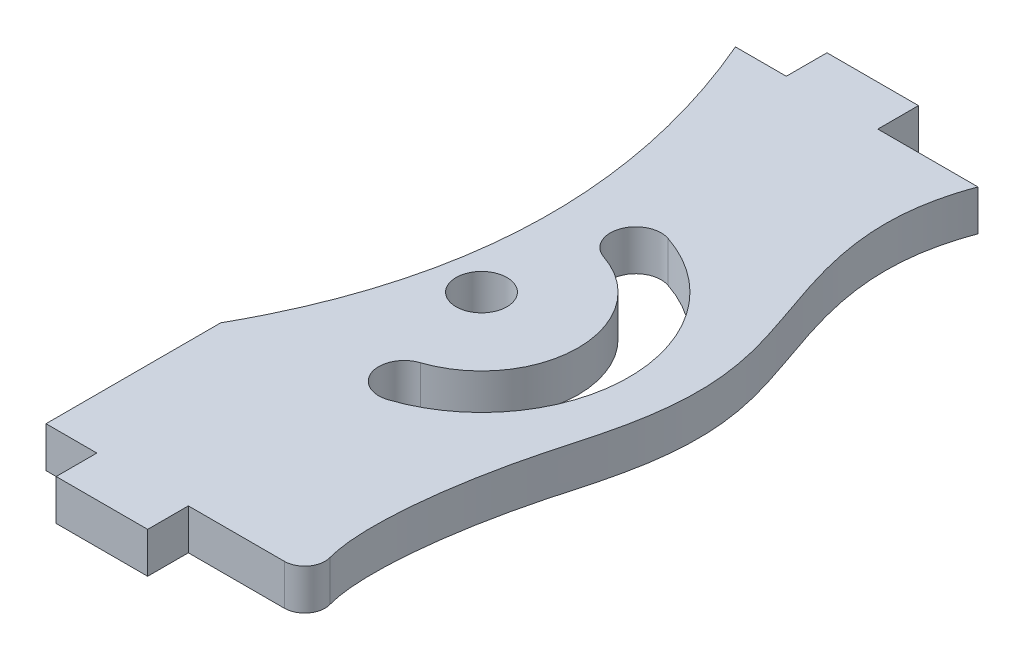
ISO-10303-21;
HEADER;
FILE_DESCRIPTION(('STEP AP214'),'2;1');
FILE_NAME('part.step','',(''),(''),'','','');
FILE_SCHEMA(('AUTOMOTIVE_DESIGN { 1 0 10303 214 1 1 1 1 }'));
ENDSEC;
DATA;
#1=APPLICATION_CONTEXT('core data for automotive mechanical design processes');
#2=APPLICATION_PROTOCOL_DEFINITION('international standard','automotive_design',2000,#1);
#3=PRODUCT_CONTEXT('',#1,'mechanical');
#4=PRODUCT('Part','Part','',(#3));
#5=PRODUCT_RELATED_PRODUCT_CATEGORY('part','',(#4));
#6=PRODUCT_DEFINITION_FORMATION('','',#4);
#7=PRODUCT_DEFINITION_CONTEXT('part definition',#1,'design');
#8=PRODUCT_DEFINITION('design','',#6,#7);
#9=PRODUCT_DEFINITION_SHAPE('','',#8);
#10=(LENGTH_UNIT() NAMED_UNIT(*) SI_UNIT(.MILLI.,.METRE.));
#11=(NAMED_UNIT(*) PLANE_ANGLE_UNIT() SI_UNIT($,.RADIAN.));
#12=(NAMED_UNIT(*) SI_UNIT($,.STERADIAN.) SOLID_ANGLE_UNIT());
#13=UNCERTAINTY_MEASURE_WITH_UNIT(LENGTH_MEASURE(1.E-05),#10,'distance_accuracy_value','');
#14=(GEOMETRIC_REPRESENTATION_CONTEXT(3) GLOBAL_UNCERTAINTY_ASSIGNED_CONTEXT((#13)) GLOBAL_UNIT_ASSIGNED_CONTEXT((#10,
#11,#12)) REPRESENTATION_CONTEXT('',''));
#15=CARTESIAN_POINT('',(0.,0.,0.));
#16=DIRECTION('',(0.,0.,1.));
#17=DIRECTION('',(1.,0.,0.));
#18=AXIS2_PLACEMENT_3D('',#15,#16,#17);
#19=CARTESIAN_POINT('',(0.,2.,-16.6892231243211));
#20=DIRECTION('',(0.,0.,-1.));
#21=DIRECTION('',(-1.,0.,0.));
#22=AXIS2_PLACEMENT_3D('',#19,#20,#21);
#23=PLANE('',#22);
#24=DIRECTION('',(1.,0.,0.));
#25=VECTOR('',#24,1.);
#26=CARTESIAN_POINT('',(0.,0.,-16.6892231243211));
#27=LINE('',#26,#25);
#28=CARTESIAN_POINT('',(-4.20050821969865,0.,-16.689223124321));
#29=VERTEX_POINT('',#28);
#30=CARTESIAN_POINT('',(-1.70050821969865,0.,-16.6892231243211));
#31=VERTEX_POINT('',#30);
#32=EDGE_CURVE('E212',#29,#31,#27,.T.);
#33=ORIENTED_EDGE('',*,*,#32,.F.);
#34=DIRECTION('',(0.,-1.,0.));
#35=VECTOR('',#34,1.);
#36=CARTESIAN_POINT('',(-4.20050821969865,2.,-16.689223124321));
#37=LINE('',#36,#35);
#38=CARTESIAN_POINT('',(-4.20050821969865,2.,-16.689223124321));
#39=VERTEX_POINT('',#38);
#40=EDGE_CURVE('E11',#39,#29,#37,.T.);
#41=ORIENTED_EDGE('',*,*,#40,.F.);
#42=DIRECTION('',(1.,0.,0.));
#43=VECTOR('',#42,1.);
#44=CARTESIAN_POINT('',(0.,2.,-16.6892231243211));
#45=LINE('',#44,#43);
#46=CARTESIAN_POINT('',(-1.70050821969865,2.,-16.6892231243211));
#47=VERTEX_POINT('',#46);
#48=EDGE_CURVE('E315',#39,#47,#45,.T.);
#49=ORIENTED_EDGE('',*,*,#48,.T.);
#50=DIRECTION('',(0.,-1.,0.));
#51=VECTOR('',#50,1.);
#52=CARTESIAN_POINT('',(-1.70050821969865,2.,-16.6892231243211));
#53=LINE('',#52,#51);
#54=EDGE_CURVE('E56',#47,#31,#53,.T.);
#55=ORIENTED_EDGE('',*,*,#54,.T.);
#56=EDGE_LOOP('',(#33,#41,#49,#55));
#57=FACE_BOUND('',#56,.T.);
#58=ADVANCED_FACE('F37',(#57),#23,.T.);
#59=CARTESIAN_POINT('',(-4.20050821969865,2.,-16.689223124321));
#60=CARTESIAN_POINT('',(1.32765164878156,2.,-3.75585627465432));
#61=CARTESIAN_POINT('',(-5.10627141831887,2.,7.71886162363008));
#62=B_SPLINE_CURVE_WITH_KNOTS('',2,(#59,#60,#61),.UNSPECIFIED.,.F.,.F.,(3,3),(0.,1.),.UNSPECIFIED.);
#63=DIRECTION('',(0.,-1.,0.));
#64=VECTOR('',#63,1.);
#65=SURFACE_OF_LINEAR_EXTRUSION('',#62,#64);
#66=CARTESIAN_POINT('',(-4.20050821969865,0.,-16.689223124321));
#67=CARTESIAN_POINT('',(1.32765164878156,0.,-3.75585627465432));
#68=CARTESIAN_POINT('',(-5.10627141831887,0.,7.71886162363008));
#69=B_SPLINE_CURVE_WITH_KNOTS('',2,(#66,#67,#68),.UNSPECIFIED.,.F.,.F.,(3,3),(0.,1.),.UNSPECIFIED.);
#70=CARTESIAN_POINT('',(-5.10627141831887,0.,7.71886162363008));
#71=VERTEX_POINT('',#70);
#72=EDGE_CURVE('E214',#29,#71,#69,.T.);
#73=ORIENTED_EDGE('',*,*,#72,.T.);
#74=DIRECTION('',(0.,-1.,0.));
#75=VECTOR('',#74,1.);
#76=CARTESIAN_POINT('',(-5.10627141831887,2.,7.71886162363008));
#77=LINE('',#76,#75);
#78=CARTESIAN_POINT('',(-5.10627141831887,2.,7.71886162363008));
#79=VERTEX_POINT('',#78);
#80=EDGE_CURVE('E47',#79,#71,#77,.T.);
#81=ORIENTED_EDGE('',*,*,#80,.F.);
#82=EDGE_CURVE('E323',#39,#79,#62,.T.);
#83=ORIENTED_EDGE('',*,*,#82,.F.);
#84=ORIENTED_EDGE('',*,*,#40,.T.);
#85=EDGE_LOOP('',(#73,#81,#83,#84));
#86=FACE_BOUND('',#85,.T.);
#87=ADVANCED_FACE('F335',(#86),#65,.F.);
#88=CARTESIAN_POINT('',(-5.10627141831887,2.,0.));
#89=DIRECTION('',(1.,0.,0.));
#90=DIRECTION('',(0.,0.,-1.));
#91=AXIS2_PLACEMENT_3D('',#88,#89,#90);
#92=PLANE('',#91);
#93=DIRECTION('',(0.,0.,1.));
#94=VECTOR('',#93,1.);
#95=CARTESIAN_POINT('',(-5.10627141831887,0.,0.));
#96=LINE('',#95,#94);
#97=CARTESIAN_POINT('',(-5.10627141831887,0.,16.310776875679));
#98=VERTEX_POINT('',#97);
#99=EDGE_CURVE('E219',#71,#98,#96,.T.);
#100=ORIENTED_EDGE('',*,*,#99,.T.);
#101=DIRECTION('',(0.,-1.,0.));
#102=VECTOR('',#101,1.);
#103=CARTESIAN_POINT('',(-5.10627141831887,2.,16.310776875679));
#104=LINE('',#103,#102);
#105=CARTESIAN_POINT('',(-5.10627141831887,2.,16.310776875679));
#106=VERTEX_POINT('',#105);
#107=EDGE_CURVE('E284',#106,#98,#104,.T.);
#108=ORIENTED_EDGE('',*,*,#107,.F.);
#109=DIRECTION('',(0.,0.,1.));
#110=VECTOR('',#109,1.);
#111=CARTESIAN_POINT('',(-5.10627141831887,2.,0.));
#112=LINE('',#111,#110);
#113=EDGE_CURVE('E329',#79,#106,#112,.T.);
#114=ORIENTED_EDGE('',*,*,#113,.F.);
#115=ORIENTED_EDGE('',*,*,#80,.T.);
#116=EDGE_LOOP('',(#100,#108,#114,#115));
#117=FACE_BOUND('',#116,.T.);
#118=ADVANCED_FACE('F339',(#117),#92,.F.);
#119=CARTESIAN_POINT('',(0.,2.,16.310776875679));
#120=DIRECTION('',(0.,0.,-1.));
#121=DIRECTION('',(-1.,0.,0.));
#122=AXIS2_PLACEMENT_3D('',#119,#120,#121);
#123=PLANE('',#122);
#124=DIRECTION('',(1.,0.,0.));
#125=VECTOR('',#124,1.);
#126=CARTESIAN_POINT('',(0.,0.,16.310776875679));
#127=LINE('',#126,#125);
#128=CARTESIAN_POINT('',(-2.60627141831887,0.,16.310776875679));
#129=VERTEX_POINT('',#128);
#130=EDGE_CURVE('E225',#98,#129,#127,.T.);
#131=ORIENTED_EDGE('',*,*,#130,.T.);
#132=DIRECTION('',(0.,-1.,0.));
#133=VECTOR('',#132,1.);
#134=CARTESIAN_POINT('',(-2.60627141831887,2.,16.310776875679));
#135=LINE('',#134,#133);
#136=CARTESIAN_POINT('',(-2.60627141831887,2.,16.310776875679));
#137=VERTEX_POINT('',#136);
#138=EDGE_CURVE('E281',#137,#129,#135,.T.);
#139=ORIENTED_EDGE('',*,*,#138,.F.);
#140=DIRECTION('',(1.,0.,0.));
#141=VECTOR('',#140,1.);
#142=CARTESIAN_POINT('',(0.,2.,16.310776875679));
#143=LINE('',#142,#141);
#144=EDGE_CURVE('E544',#106,#137,#143,.T.);
#145=ORIENTED_EDGE('',*,*,#144,.F.);
#146=ORIENTED_EDGE('',*,*,#107,.T.);
#147=EDGE_LOOP('',(#131,#139,#145,#146));
#148=FACE_BOUND('',#147,.T.);
#149=ADVANCED_FACE('F507',(#148),#123,.F.);
#150=CARTESIAN_POINT('',(-2.60627141831887,2.,0.));
#151=DIRECTION('',(1.,0.,0.));
#152=DIRECTION('',(0.,0.,-1.));
#153=AXIS2_PLACEMENT_3D('',#150,#151,#152);
#154=PLANE('',#153);
#155=DIRECTION('',(0.,0.,1.));
#156=VECTOR('',#155,1.);
#157=CARTESIAN_POINT('',(-2.60627141831887,0.,0.));
#158=LINE('',#157,#156);
#159=CARTESIAN_POINT('',(-2.60627141831887,0.,18.310776875679));
#160=VERTEX_POINT('',#159);
#161=EDGE_CURVE('E228',#129,#160,#158,.T.);
#162=ORIENTED_EDGE('',*,*,#161,.T.);
#163=DIRECTION('',(0.,-1.,0.));
#164=VECTOR('',#163,1.);
#165=CARTESIAN_POINT('',(-2.60627141831887,2.,18.310776875679));
#166=LINE('',#165,#164);
#167=CARTESIAN_POINT('',(-2.60627141831887,2.,18.310776875679));
#168=VERTEX_POINT('',#167);
#169=EDGE_CURVE('E278',#168,#160,#166,.T.);
#170=ORIENTED_EDGE('',*,*,#169,.F.);
#171=DIRECTION('',(0.,0.,1.));
#172=VECTOR('',#171,1.);
#173=CARTESIAN_POINT('',(-2.60627141831887,2.,0.));
#174=LINE('',#173,#172);
#175=EDGE_CURVE('E547',#137,#168,#174,.T.);
#176=ORIENTED_EDGE('',*,*,#175,.F.);
#177=ORIENTED_EDGE('',*,*,#138,.T.);
#178=EDGE_LOOP('',(#162,#170,#176,#177));
#179=FACE_BOUND('',#178,.T.);
#180=ADVANCED_FACE('F497',(#179),#154,.F.);
#181=CARTESIAN_POINT('',(0.,2.,18.310776875679));
#182=DIRECTION('',(0.,0.,-1.));
#183=DIRECTION('',(-1.,0.,0.));
#184=AXIS2_PLACEMENT_3D('',#181,#182,#183);
#185=PLANE('',#184);
#186=DIRECTION('',(1.,0.,0.));
#187=VECTOR('',#186,1.);
#188=CARTESIAN_POINT('',(0.,0.,18.310776875679));
#189=LINE('',#188,#187);
#190=CARTESIAN_POINT('',(1.89372858168113,0.,18.310776875679));
#191=VERTEX_POINT('',#190);
#192=EDGE_CURVE('E231',#160,#191,#189,.T.);
#193=ORIENTED_EDGE('',*,*,#192,.T.);
#194=DIRECTION('',(0.,-1.,0.));
#195=VECTOR('',#194,1.);
#196=CARTESIAN_POINT('',(1.89372858168113,2.,18.310776875679));
#197=LINE('',#196,#195);
#198=CARTESIAN_POINT('',(1.89372858168113,2.,18.310776875679));
#199=VERTEX_POINT('',#198);
#200=EDGE_CURVE('E275',#199,#191,#197,.T.);
#201=ORIENTED_EDGE('',*,*,#200,.F.);
#202=DIRECTION('',(1.,0.,0.));
#203=VECTOR('',#202,1.);
#204=CARTESIAN_POINT('',(0.,2.,18.310776875679));
#205=LINE('',#204,#203);
#206=EDGE_CURVE('E549',#168,#199,#205,.T.);
#207=ORIENTED_EDGE('',*,*,#206,.F.);
#208=ORIENTED_EDGE('',*,*,#169,.T.);
#209=EDGE_LOOP('',(#193,#201,#207,#208));
#210=FACE_BOUND('',#209,.T.);
#211=ADVANCED_FACE('F487',(#210),#185,.F.);
#212=CARTESIAN_POINT('',(1.89372858168113,2.,0.));
#213=DIRECTION('',(-1.,0.,0.));
#214=DIRECTION('',(0.,0.,1.));
#215=AXIS2_PLACEMENT_3D('',#212,#213,#214);
#216=PLANE('',#215);
#217=DIRECTION('',(0.,0.,-1.));
#218=VECTOR('',#217,1.);
#219=CARTESIAN_POINT('',(1.89372858168113,0.,0.));
#220=LINE('',#219,#218);
#221=CARTESIAN_POINT('',(1.89372858168113,0.,16.3107768756788));
#222=VERTEX_POINT('',#221);
#223=EDGE_CURVE('E234',#191,#222,#220,.T.);
#224=ORIENTED_EDGE('',*,*,#223,.T.);
#225=DIRECTION('',(0.,-1.,0.));
#226=VECTOR('',#225,1.);
#227=CARTESIAN_POINT('',(1.89372858168113,2.,16.3107768756788));
#228=LINE('',#227,#226);
#229=CARTESIAN_POINT('',(1.89372858168113,2.,16.3107768756788));
#230=VERTEX_POINT('',#229);
#231=EDGE_CURVE('E272',#230,#222,#228,.T.);
#232=ORIENTED_EDGE('',*,*,#231,.F.);
#233=DIRECTION('',(0.,0.,-1.));
#234=VECTOR('',#233,1.);
#235=CARTESIAN_POINT('',(1.89372858168113,2.,0.));
#236=LINE('',#235,#234);
#237=EDGE_CURVE('E554',#199,#230,#236,.T.);
#238=ORIENTED_EDGE('',*,*,#237,.F.);
#239=ORIENTED_EDGE('',*,*,#200,.T.);
#240=EDGE_LOOP('',(#224,#232,#238,#239));
#241=FACE_BOUND('',#240,.T.);
#242=ADVANCED_FACE('F478',(#241),#216,.F.);
#243=CARTESIAN_POINT('',(0.,2.,16.3107768756788));
#244=DIRECTION('',(0.,0.,-1.));
#245=DIRECTION('',(-1.,0.,0.));
#246=AXIS2_PLACEMENT_3D('',#243,#244,#245);
#247=PLANE('',#246);
#248=DIRECTION('',(1.,0.,0.));
#249=VECTOR('',#248,1.);
#250=CARTESIAN_POINT('',(0.,0.,16.3107768756788));
#251=LINE('',#250,#249);
#252=CARTESIAN_POINT('',(6.61505902932618,0.,16.3107768756788));
#253=VERTEX_POINT('',#252);
#254=EDGE_CURVE('E237',#222,#253,#251,.T.);
#255=ORIENTED_EDGE('',*,*,#254,.T.);
#256=DIRECTION('',(0.,-1.,0.));
#257=VECTOR('',#256,1.);
#258=CARTESIAN_POINT('',(6.61505902932618,2.,16.3107768756788));
#259=LINE('',#258,#257);
#260=CARTESIAN_POINT('',(6.61505902932618,2.,16.3107768756788));
#261=VERTEX_POINT('',#260);
#262=EDGE_CURVE('E269',#261,#253,#259,.T.);
#263=ORIENTED_EDGE('',*,*,#262,.F.);
#264=DIRECTION('',(1.,0.,0.));
#265=VECTOR('',#264,1.);
#266=CARTESIAN_POINT('',(0.,2.,16.3107768756788));
#267=LINE('',#266,#265);
#268=EDGE_CURVE('E556',#230,#261,#267,.T.);
#269=ORIENTED_EDGE('',*,*,#268,.F.);
#270=ORIENTED_EDGE('',*,*,#231,.T.);
#271=EDGE_LOOP('',(#255,#263,#269,#270));
#272=FACE_BOUND('',#271,.T.);
#273=ADVANCED_FACE('F469',(#272),#247,.F.);
#274=CARTESIAN_POINT('',(6.61505902932615,2.,15.3107768756788));
#275=DIRECTION('',(0.,-1.,0.));
#276=DIRECTION('',(0.,0.,-1.));
#277=AXIS2_PLACEMENT_3D('',#274,#275,#276);
#278=CYLINDRICAL_SURFACE('',#277,1.);
#279=CARTESIAN_POINT('',(6.61505902932615,0.,15.3107768756788));
#280=DIRECTION('',(0.,1.,0.));
#281=DIRECTION('',(0.,0.,1.));
#282=AXIS2_PLACEMENT_3D('',#279,#280,#281);
#283=CIRCLE('',#282,1.);
#284=CARTESIAN_POINT('',(7.57770782930355,0.,15.0400236893595));
#285=VERTEX_POINT('',#284);
#286=EDGE_CURVE('E240',#253,#285,#283,.T.);
#287=ORIENTED_EDGE('',*,*,#286,.T.);
#288=DIRECTION('',(0.,-1.,0.));
#289=VECTOR('',#288,1.);
#290=CARTESIAN_POINT('',(7.57770782930355,2.,15.0400236893595));
#291=LINE('',#290,#289);
#292=CARTESIAN_POINT('',(7.57770782930355,2.,15.0400236893595));
#293=VERTEX_POINT('',#292);
#294=EDGE_CURVE('E266',#293,#285,#291,.T.);
#295=ORIENTED_EDGE('',*,*,#294,.F.);
#296=CARTESIAN_POINT('',(6.61505902932615,2.,15.3107768756788));
#297=DIRECTION('',(0.,1.,0.));
#298=DIRECTION('',(0.,0.,1.));
#299=AXIS2_PLACEMENT_3D('',#296,#297,#298);
#300=CIRCLE('',#299,1.);
#301=EDGE_CURVE('E378',#261,#293,#300,.T.);
#302=ORIENTED_EDGE('',*,*,#301,.F.);
#303=ORIENTED_EDGE('',*,*,#262,.T.);
#304=EDGE_LOOP('',(#287,#295,#302,#303));
#305=FACE_BOUND('',#304,.T.);
#306=ADVANCED_FACE('F370',(#305),#278,.T.);
#307=CARTESIAN_POINT('',(7.57770782930355,2.,15.0400236893595));
#308=CARTESIAN_POINT('',(7.00909512510785,2.,13.0183509445731));
#309=CARTESIAN_POINT('',(7.47969692866913,2.,8.28183880739016));
#310=CARTESIAN_POINT('',(9.83705416201464,2.,0.269934455976373));
#311=CARTESIAN_POINT('',(9.50688629569029,2.,-5.62574393239638));
#312=CARTESIAN_POINT('',(5.89977686275604,2.,-11.8315781431959));
#313=CARTESIAN_POINT('',(7.72660022323635,2.,-16.6892231243211));
#314=B_SPLINE_CURVE_WITH_KNOTS('',3,(#307,#308,#309,#310,#311,#312,#313),.UNSPECIFIED.,.F.,.F.,
(4,1,1,1,4),(0.0786678134292182,0.337938342238142,0.393992599432671,0.639210385374511,1.),.UNSPECIFIED.);
#315=DIRECTION('',(0.,-1.,0.));
#316=VECTOR('',#315,1.);
#317=SURFACE_OF_LINEAR_EXTRUSION('',#314,#316);
#318=CARTESIAN_POINT('',(7.57770782930355,0.,15.0400236893595));
#319=CARTESIAN_POINT('',(7.00909512510785,0.,13.0183509445731));
#320=CARTESIAN_POINT('',(7.47969692866913,0.,8.28183880739016));
#321=CARTESIAN_POINT('',(9.83705416201464,0.,0.269934455976373));
#322=CARTESIAN_POINT('',(9.50688629569029,0.,-5.62574393239638));
#323=CARTESIAN_POINT('',(5.89977686275604,0.,-11.8315781431959));
#324=CARTESIAN_POINT('',(7.72660022323635,0.,-16.6892231243211));
#325=B_SPLINE_CURVE_WITH_KNOTS('',3,(#318,#319,#320,#321,#322,#323,#324),.UNSPECIFIED.,.F.,.F.,
(4,1,1,1,4),(0.0786678134292182,0.337938342238142,0.393992599432671,0.639210385374511,1.),.UNSPECIFIED.);
#326=CARTESIAN_POINT('',(7.72660022323635,0.,-16.689223124321));
#327=VERTEX_POINT('',#326);
#328=EDGE_CURVE('E243',#285,#327,#325,.T.);
#329=ORIENTED_EDGE('',*,*,#328,.T.);
#330=DIRECTION('',(0.,-1.,0.));
#331=VECTOR('',#330,1.);
#332=CARTESIAN_POINT('',(7.72660022323635,2.,-16.689223124321));
#333=LINE('',#332,#331);
#334=CARTESIAN_POINT('',(7.72660022323635,2.,-16.689223124321));
#335=VERTEX_POINT('',#334);
#336=EDGE_CURVE('E264',#335,#327,#333,.T.);
#337=ORIENTED_EDGE('',*,*,#336,.F.);
#338=EDGE_CURVE('E373',#293,#335,#314,.T.);
#339=ORIENTED_EDGE('',*,*,#338,.F.);
#340=ORIENTED_EDGE('',*,*,#294,.T.);
#341=EDGE_LOOP('',(#329,#337,#339,#340));
#342=FACE_BOUND('',#341,.T.);
#343=ADVANCED_FACE('F365',(#342),#317,.F.);
#344=CARTESIAN_POINT('',(0.,2.,-16.689223124321));
#345=DIRECTION('',(0.,0.,-1.));
#346=DIRECTION('',(-1.,0.,0.));
#347=AXIS2_PLACEMENT_3D('',#344,#345,#346);
#348=PLANE('',#347);
#349=DIRECTION('',(1.,0.,0.));
#350=VECTOR('',#349,1.);
#351=CARTESIAN_POINT('',(0.,0.,-16.689223124321));
#352=LINE('',#351,#350);
#353=CARTESIAN_POINT('',(2.79949178030135,0.,-16.689223124321));
#354=VERTEX_POINT('',#353);
#355=EDGE_CURVE('E248',#354,#327,#352,.T.);
#356=ORIENTED_EDGE('',*,*,#355,.F.);
#357=DIRECTION('',(0.,-1.,0.));
#358=VECTOR('',#357,1.);
#359=CARTESIAN_POINT('',(2.79949178030135,2.,-16.689223124321));
#360=LINE('',#359,#358);
#361=CARTESIAN_POINT('',(2.79949178030135,2.,-16.689223124321));
#362=VERTEX_POINT('',#361);
#363=EDGE_CURVE('E178',#362,#354,#360,.T.);
#364=ORIENTED_EDGE('',*,*,#363,.F.);
#365=DIRECTION('',(1.,0.,0.));
#366=VECTOR('',#365,1.);
#367=CARTESIAN_POINT('',(0.,2.,-16.689223124321));
#368=LINE('',#367,#366);
#369=EDGE_CURVE('E188',#362,#335,#368,.T.);
#370=ORIENTED_EDGE('',*,*,#369,.T.);
#371=ORIENTED_EDGE('',*,*,#336,.T.);
#372=EDGE_LOOP('',(#356,#364,#370,#371));
#373=FACE_BOUND('',#372,.T.);
#374=ADVANCED_FACE('F357',(#373),#348,.T.);
#375=CARTESIAN_POINT('',(2.79949178030136,2.,0.));
#376=DIRECTION('',(1.,0.,0.));
#377=DIRECTION('',(0.,0.,-1.));
#378=AXIS2_PLACEMENT_3D('',#375,#376,#377);
#379=PLANE('',#378);
#380=DIRECTION('',(0.,0.,1.));
#381=VECTOR('',#380,1.);
#382=CARTESIAN_POINT('',(2.79949178030136,0.,0.));
#383=LINE('',#382,#381);
#384=CARTESIAN_POINT('',(2.79949178030135,0.,-18.689223124321));
#385=VERTEX_POINT('',#384);
#386=EDGE_CURVE('E174',#385,#354,#383,.T.);
#387=ORIENTED_EDGE('',*,*,#386,.F.);
#388=DIRECTION('',(0.,-1.,0.));
#389=VECTOR('',#388,1.);
#390=CARTESIAN_POINT('',(2.79949178030135,2.,-18.689223124321));
#391=LINE('',#390,#389);
#392=CARTESIAN_POINT('',(2.79949178030135,2.,-18.689223124321));
#393=VERTEX_POINT('',#392);
#394=EDGE_CURVE('E169',#393,#385,#391,.T.);
#395=ORIENTED_EDGE('',*,*,#394,.F.);
#396=DIRECTION('',(0.,0.,1.));
#397=VECTOR('',#396,1.);
#398=CARTESIAN_POINT('',(2.79949178030136,2.,0.));
#399=LINE('',#398,#397);
#400=EDGE_CURVE('E172',#393,#362,#399,.T.);
#401=ORIENTED_EDGE('',*,*,#400,.T.);
#402=ORIENTED_EDGE('',*,*,#363,.T.);
#403=EDGE_LOOP('',(#387,#395,#401,#402));
#404=FACE_BOUND('',#403,.T.);
#405=ADVANCED_FACE('F171',(#404),#379,.T.);
#406=CARTESIAN_POINT('',(0.,2.,-18.689223124321));
#407=DIRECTION('',(0.,0.,-1.));
#408=DIRECTION('',(-1.,0.,0.));
#409=AXIS2_PLACEMENT_3D('',#406,#407,#408);
#410=PLANE('',#409);
#411=DIRECTION('',(1.,0.,0.));
#412=VECTOR('',#411,1.);
#413=CARTESIAN_POINT('',(0.,0.,-18.689223124321));
#414=LINE('',#413,#412);
#415=CARTESIAN_POINT('',(-1.70050821969865,0.,-18.689223124321));
#416=VERTEX_POINT('',#415);
#417=EDGE_CURVE('E255',#416,#385,#414,.T.);
#418=ORIENTED_EDGE('',*,*,#417,.F.);
#419=DIRECTION('',(0.,-1.,0.));
#420=VECTOR('',#419,1.);
#421=CARTESIAN_POINT('',(-1.70050821969865,2.,-18.689223124321));
#422=LINE('',#421,#420);
#423=CARTESIAN_POINT('',(-1.70050821969865,2.,-18.689223124321));
#424=VERTEX_POINT('',#423);
#425=EDGE_CURVE('E111',#424,#416,#422,.T.);
#426=ORIENTED_EDGE('',*,*,#425,.F.);
#427=DIRECTION('',(1.,0.,0.));
#428=VECTOR('',#427,1.);
#429=CARTESIAN_POINT('',(0.,2.,-18.689223124321));
#430=LINE('',#429,#428);
#431=EDGE_CURVE('E186',#424,#393,#430,.T.);
#432=ORIENTED_EDGE('',*,*,#431,.T.);
#433=ORIENTED_EDGE('',*,*,#394,.T.);
#434=EDGE_LOOP('',(#418,#426,#432,#433));
#435=FACE_BOUND('',#434,.T.);
#436=ADVANCED_FACE('F190',(#435),#410,.T.);
#437=CARTESIAN_POINT('',(1.89241989306857,2.,-5.69374630171721));
#438=DIRECTION('',(0.,-1.,0.));
#439=DIRECTION('',(0.,0.,-1.));
#440=AXIS2_PLACEMENT_3D('',#437,#438,#439);
#441=CYLINDRICAL_SURFACE('',#440,1.25000000000004);
#442=CARTESIAN_POINT('',(1.89241989306857,0.,-5.69374630171721));
#443=DIRECTION('',(0.,1.,0.));
#444=DIRECTION('',(0.,0.,1.));
#445=AXIS2_PLACEMENT_3D('',#442,#443,#444);
#446=CIRCLE('',#445,1.25000000000004);
#447=CARTESIAN_POINT('',(2.28667403745785,0.,-6.87994344790829));
#448=VERTEX_POINT('',#447);
#449=CARTESIAN_POINT('',(1.49816574867925,0.,-4.50754915552604));
#450=VERTEX_POINT('',#449);
#451=EDGE_CURVE('E200',#448,#450,#446,.T.);
#452=ORIENTED_EDGE('',*,*,#451,.F.);
#453=DIRECTION('',(0.,-1.,0.));
#454=VECTOR('',#453,1.);
#455=CARTESIAN_POINT('',(2.28667403745785,2.,-6.87994344790829));
#456=LINE('',#455,#454);
#457=CARTESIAN_POINT('',(2.28667403745785,2.,-6.87994344790829));
#458=VERTEX_POINT('',#457);
#459=EDGE_CURVE('E41',#458,#448,#456,.T.);
#460=ORIENTED_EDGE('',*,*,#459,.F.);
#461=CARTESIAN_POINT('',(1.89241989306857,2.,-5.69374630171721));
#462=DIRECTION('',(0.,1.,0.));
#463=DIRECTION('',(0.,0.,1.));
#464=AXIS2_PLACEMENT_3D('',#461,#462,#463);
#465=CIRCLE('',#464,1.25000000000004);
#466=CARTESIAN_POINT('',(1.49816574867925,2.,-4.50754915552604));
#467=VERTEX_POINT('',#466);
#468=EDGE_CURVE('E318',#458,#467,#465,.T.);
#469=ORIENTED_EDGE('',*,*,#468,.T.);
#470=DIRECTION('',(0.,-1.,0.));
#471=VECTOR('',#470,1.);
#472=CARTESIAN_POINT('',(1.49816574867925,2.,-4.50754915552604));
#473=LINE('',#472,#471);
#474=EDGE_CURVE('E193',#467,#450,#473,.T.);
#475=ORIENTED_EDGE('',*,*,#474,.T.);
#476=EDGE_LOOP('',(#452,#460,#469,#475));
#477=FACE_BOUND('',#476,.T.);
#478=ADVANCED_FACE('F301',(#477),#441,.F.);
#479=CARTESIAN_POINT('',(0.,2.,0.));
#480=DIRECTION('',(0.,-1.,0.));
#481=DIRECTION('',(0.,0.,-1.));
#482=AXIS2_PLACEMENT_3D('',#479,#480,#481);
#483=CYLINDRICAL_SURFACE('',#482,7.25000000000004);
#484=CARTESIAN_POINT('',(0.,0.,0.));
#485=DIRECTION('',(0.,1.,0.));
#486=DIRECTION('',(0.,0.,1.));
#487=AXIS2_PLACEMENT_3D('',#484,#485,#486);
#488=CIRCLE('',#487,7.25000000000004);
#489=CARTESIAN_POINT('',(2.2866740374579,0.,6.87994344790835));
#490=VERTEX_POINT('',#489);
#491=EDGE_CURVE('E203',#490,#448,#488,.T.);
#492=ORIENTED_EDGE('',*,*,#491,.F.);
#493=DIRECTION('',(0.,-1.,0.));
#494=VECTOR('',#493,1.);
#495=CARTESIAN_POINT('',(2.2866740374579,2.,6.87994344790835));
#496=LINE('',#495,#494);
#497=CARTESIAN_POINT('',(2.2866740374579,2.,6.87994344790835));
#498=VERTEX_POINT('',#497);
#499=EDGE_CURVE('E291',#498,#490,#496,.T.);
#500=ORIENTED_EDGE('',*,*,#499,.F.);
#501=CARTESIAN_POINT('',(0.,2.,0.));
#502=DIRECTION('',(0.,1.,0.));
#503=DIRECTION('',(0.,0.,1.));
#504=AXIS2_PLACEMENT_3D('',#501,#502,#503);
#505=CIRCLE('',#504,7.25000000000004);
#506=EDGE_CURVE('E300',#498,#458,#505,.T.);
#507=ORIENTED_EDGE('',*,*,#506,.T.);
#508=ORIENTED_EDGE('',*,*,#459,.T.);
#509=EDGE_LOOP('',(#492,#500,#507,#508));
#510=FACE_BOUND('',#509,.T.);
#511=ADVANCED_FACE('F298',(#510),#483,.F.);
#512=CARTESIAN_POINT('',(1.89241989306859,2.,5.69374630171723));
#513=DIRECTION('',(0.,-1.,0.));
#514=DIRECTION('',(0.,0.,-1.));
#515=AXIS2_PLACEMENT_3D('',#512,#513,#514);
#516=CYLINDRICAL_SURFACE('',#515,1.25000000000005);
#517=CARTESIAN_POINT('',(1.89241989306859,0.,5.69374630171723));
#518=DIRECTION('',(0.,1.,0.));
#519=DIRECTION('',(0.,0.,1.));
#520=AXIS2_PLACEMENT_3D('',#517,#518,#519);
#521=CIRCLE('',#520,1.25000000000005);
#522=CARTESIAN_POINT('',(1.49816574867928,0.,4.5075491555261));
#523=VERTEX_POINT('',#522);
#524=EDGE_CURVE('E206',#523,#490,#521,.T.);
#525=ORIENTED_EDGE('',*,*,#524,.F.);
#526=DIRECTION('',(0.,-1.,0.));
#527=VECTOR('',#526,1.);
#528=CARTESIAN_POINT('',(1.49816574867928,2.,4.5075491555261));
#529=LINE('',#528,#527);
#530=CARTESIAN_POINT('',(1.49816574867928,2.,4.5075491555261));
#531=VERTEX_POINT('',#530);
#532=EDGE_CURVE('E290',#531,#523,#529,.T.);
#533=ORIENTED_EDGE('',*,*,#532,.F.);
#534=CARTESIAN_POINT('',(1.89241989306859,2.,5.69374630171723));
#535=DIRECTION('',(0.,1.,0.));
#536=DIRECTION('',(0.,0.,1.));
#537=AXIS2_PLACEMENT_3D('',#534,#535,#536);
#538=CIRCLE('',#537,1.25000000000005);
#539=EDGE_CURVE('E310',#531,#498,#538,.T.);
#540=ORIENTED_EDGE('',*,*,#539,.T.);
#541=ORIENTED_EDGE('',*,*,#499,.T.);
#542=EDGE_LOOP('',(#525,#533,#540,#541));
#543=FACE_BOUND('',#542,.T.);
#544=ADVANCED_FACE('F307',(#543),#516,.F.);
#545=CARTESIAN_POINT('',(0.,2.,0.));
#546=DIRECTION('',(0.,-1.,0.));
#547=DIRECTION('',(0.,0.,-1.));
#548=AXIS2_PLACEMENT_3D('',#545,#546,#547);
#549=CYLINDRICAL_SURFACE('',#548,4.74999999999995);
#550=CARTESIAN_POINT('',(0.,0.,0.));
#551=DIRECTION('',(0.,1.,0.));
#552=DIRECTION('',(0.,0.,1.));
#553=AXIS2_PLACEMENT_3D('',#550,#551,#552);
#554=CIRCLE('',#553,4.74999999999995);
#555=EDGE_CURVE('E209',#523,#450,#554,.T.);
#556=ORIENTED_EDGE('',*,*,#555,.T.);
#557=ORIENTED_EDGE('',*,*,#474,.F.);
#558=CARTESIAN_POINT('',(0.,2.,0.));
#559=DIRECTION('',(0.,1.,0.));
#560=DIRECTION('',(0.,0.,1.));
#561=AXIS2_PLACEMENT_3D('',#558,#559,#560);
#562=CIRCLE('',#561,4.74999999999995);
#563=EDGE_CURVE('E312',#531,#467,#562,.T.);
#564=ORIENTED_EDGE('',*,*,#563,.F.);
#565=ORIENTED_EDGE('',*,*,#532,.T.);
#566=EDGE_LOOP('',(#556,#557,#564,#565));
#567=FACE_BOUND('',#566,.T.);
#568=ADVANCED_FACE('F313',(#567),#549,.T.);
#569=CARTESIAN_POINT('',(0.,2.,0.));
#570=DIRECTION('',(0.,-1.,0.));
#571=DIRECTION('',(0.,0.,-1.));
#572=AXIS2_PLACEMENT_3D('',#569,#570,#571);
#573=CYLINDRICAL_SURFACE('',#572,1.25);
#574=CARTESIAN_POINT('',(0.,2.,0.));
#575=DIRECTION('',(0.,1.,0.));
#576=DIRECTION('',(0.,0.,1.));
#577=AXIS2_PLACEMENT_3D('',#574,#575,#576);
#578=CIRCLE('',#577,1.25);
#579=CARTESIAN_POINT('',(0.,2.,1.25));
#580=VERTEX_POINT('',#579);
#581=EDGE_CURVE('E260',#580,#580,#578,.T.);
#582=ORIENTED_EDGE('',*,*,#581,.T.);
#583=EDGE_LOOP('',(#582));
#584=FACE_BOUND('',#583,.T.);
#585=CARTESIAN_POINT('',(0.,0.,0.));
#586=DIRECTION('',(0.,1.,0.));
#587=DIRECTION('',(0.,0.,1.));
#588=AXIS2_PLACEMENT_3D('',#585,#586,#587);
#589=CIRCLE('',#588,1.25);
#590=CARTESIAN_POINT('',(0.,0.,1.25));
#591=VERTEX_POINT('',#590);
#592=EDGE_CURVE('E197',#591,#591,#589,.T.);
#593=ORIENTED_EDGE('',*,*,#592,.F.);
#594=EDGE_LOOP('',(#593));
#595=FACE_BOUND('',#594,.T.);
#596=ADVANCED_FACE('F39',(#584,#595),#573,.F.);
#597=CARTESIAN_POINT('',(-1.70050821969864,2.,0.));
#598=DIRECTION('',(-1.,0.,0.));
#599=DIRECTION('',(0.,0.,1.));
#600=AXIS2_PLACEMENT_3D('',#597,#598,#599);
#601=PLANE('',#600);
#602=DIRECTION('',(0.,0.,-1.));
#603=VECTOR('',#602,1.);
#604=CARTESIAN_POINT('',(-1.70050821969864,0.,0.));
#605=LINE('',#604,#603);
#606=EDGE_CURVE('E257',#31,#416,#605,.T.);
#607=ORIENTED_EDGE('',*,*,#606,.F.);
#608=ORIENTED_EDGE('',*,*,#54,.F.);
#609=DIRECTION('',(0.,0.,-1.));
#610=VECTOR('',#609,1.);
#611=CARTESIAN_POINT('',(-1.70050821969864,2.,0.));
#612=LINE('',#611,#610);
#613=EDGE_CURVE('E191',#47,#424,#612,.T.);
#614=ORIENTED_EDGE('',*,*,#613,.T.);
#615=ORIENTED_EDGE('',*,*,#425,.T.);
#616=EDGE_LOOP('',(#607,#608,#614,#615));
#617=FACE_BOUND('',#616,.T.);
#618=ADVANCED_FACE('F360',(#617),#601,.T.);
#619=CARTESIAN_POINT('',(0.,2.,0.));
#620=DIRECTION('',(0.,1.,0.));
#621=DIRECTION('',(0.,0.,1.));
#622=AXIS2_PLACEMENT_3D('',#619,#620,#621);
#623=PLANE('',#622);
#624=ORIENTED_EDGE('',*,*,#581,.F.);
#625=EDGE_LOOP('',(#624));
#626=FACE_BOUND('',#625,.T.);
#627=ORIENTED_EDGE('',*,*,#468,.F.);
#628=ORIENTED_EDGE('',*,*,#506,.F.);
#629=ORIENTED_EDGE('',*,*,#539,.F.);
#630=ORIENTED_EDGE('',*,*,#563,.T.);
#631=EDGE_LOOP('',(#627,#628,#629,#630));
#632=FACE_BOUND('',#631,.T.);
#633=ORIENTED_EDGE('',*,*,#48,.F.);
#634=ORIENTED_EDGE('',*,*,#82,.T.);
#635=ORIENTED_EDGE('',*,*,#113,.T.);
#636=ORIENTED_EDGE('',*,*,#144,.T.);
#637=ORIENTED_EDGE('',*,*,#175,.T.);
#638=ORIENTED_EDGE('',*,*,#206,.T.);
#639=ORIENTED_EDGE('',*,*,#237,.T.);
#640=ORIENTED_EDGE('',*,*,#268,.T.);
#641=ORIENTED_EDGE('',*,*,#301,.T.);
#642=ORIENTED_EDGE('',*,*,#338,.T.);
#643=ORIENTED_EDGE('',*,*,#369,.F.);
#644=ORIENTED_EDGE('',*,*,#400,.F.);
#645=ORIENTED_EDGE('',*,*,#431,.F.);
#646=ORIENTED_EDGE('',*,*,#613,.F.);
#647=EDGE_LOOP('',(#633,#634,#635,#636,#637,#638,#639,#640,#641,#642,#643,#644,#645,#646));
#648=FACE_BOUND('',#647,.T.);
#649=ADVANCED_FACE('F184',(#626,#632,#648),#623,.T.);
#650=CARTESIAN_POINT('',(0.,0.,0.));
#651=DIRECTION('',(0.,1.,0.));
#652=DIRECTION('',(0.,0.,1.));
#653=AXIS2_PLACEMENT_3D('',#650,#651,#652);
#654=PLANE('',#653);
#655=ORIENTED_EDGE('',*,*,#592,.T.);
#656=EDGE_LOOP('',(#655));
#657=FACE_BOUND('',#656,.T.);
#658=ORIENTED_EDGE('',*,*,#451,.T.);
#659=ORIENTED_EDGE('',*,*,#555,.F.);
#660=ORIENTED_EDGE('',*,*,#524,.T.);
#661=ORIENTED_EDGE('',*,*,#491,.T.);
#662=EDGE_LOOP('',(#658,#659,#660,#661));
#663=FACE_BOUND('',#662,.T.);
#664=ORIENTED_EDGE('',*,*,#32,.T.);
#665=ORIENTED_EDGE('',*,*,#606,.T.);
#666=ORIENTED_EDGE('',*,*,#417,.T.);
#667=ORIENTED_EDGE('',*,*,#386,.T.);
#668=ORIENTED_EDGE('',*,*,#355,.T.);
#669=ORIENTED_EDGE('',*,*,#328,.F.);
#670=ORIENTED_EDGE('',*,*,#286,.F.);
#671=ORIENTED_EDGE('',*,*,#254,.F.);
#672=ORIENTED_EDGE('',*,*,#223,.F.);
#673=ORIENTED_EDGE('',*,*,#192,.F.);
#674=ORIENTED_EDGE('',*,*,#161,.F.);
#675=ORIENTED_EDGE('',*,*,#130,.F.);
#676=ORIENTED_EDGE('',*,*,#99,.F.);
#677=ORIENTED_EDGE('',*,*,#72,.F.);
#678=EDGE_LOOP('',(#664,#665,#666,#667,#668,#669,#670,#671,#672,#673,#674,#675,#676,#677));
#679=FACE_BOUND('',#678,.T.);
#680=ADVANCED_FACE('F305',(#657,#663,#679),#654,.F.);
#681=CLOSED_SHELL('',(#58,#87,#118,#149,#180,#211,#242,#273,#306,#343,#374,#405,#436,#478,#511,
#544,#568,#596,#618,#649,#680));
#682=MANIFOLD_SOLID_BREP('B2',#681);
#683=ADVANCED_BREP_SHAPE_REPRESENTATION('',(#18,#682),#14);
#684=SHAPE_DEFINITION_REPRESENTATION(#9,#683);
ENDSEC;
END-ISO-10303-21;
